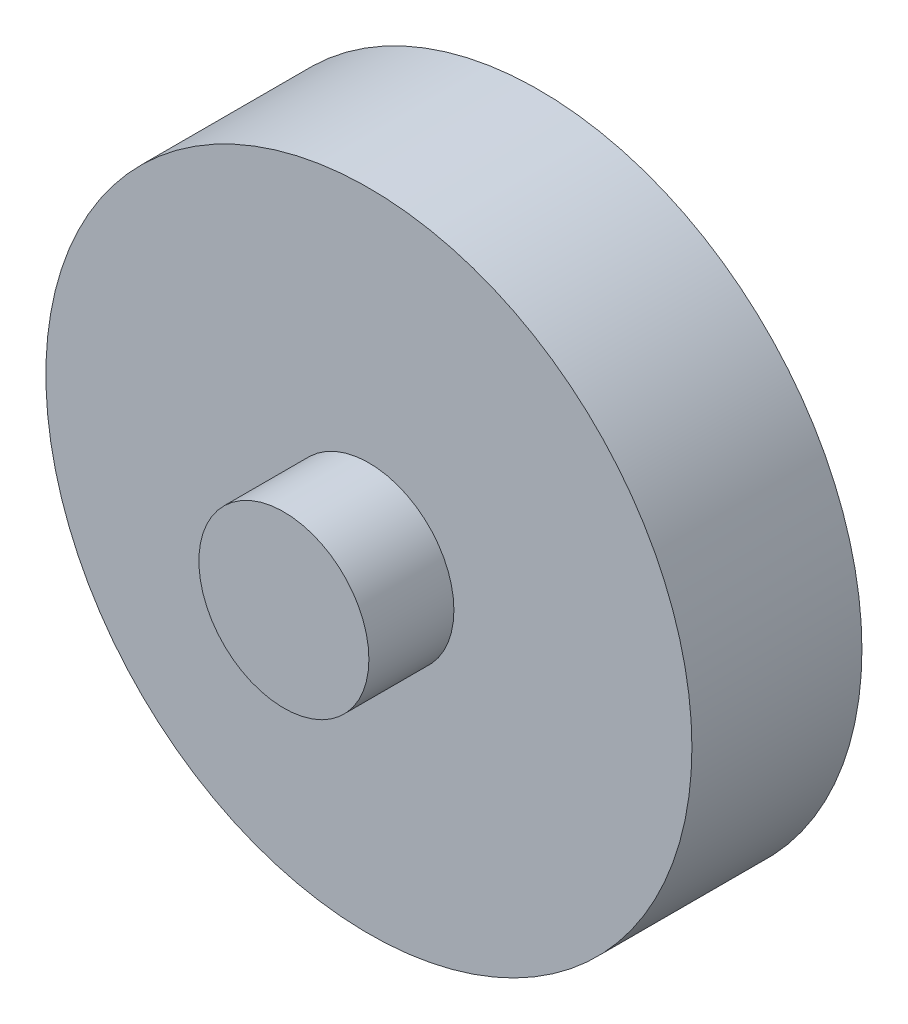
ISO-10303-21;
HEADER;
FILE_DESCRIPTION(('STEP AP214'),'2;1');
FILE_NAME('part.step','',(''),(''),'','','');
FILE_SCHEMA(('AUTOMOTIVE_DESIGN { 1 0 10303 214 1 1 1 1 }'));
ENDSEC;
DATA;
#1=APPLICATION_CONTEXT('core data for automotive mechanical design processes');
#2=APPLICATION_PROTOCOL_DEFINITION('international standard','automotive_design',2000,#1);
#3=PRODUCT_CONTEXT('',#1,'mechanical');
#4=PRODUCT('Part','Part','',(#3));
#5=PRODUCT_RELATED_PRODUCT_CATEGORY('part','',(#4));
#6=PRODUCT_DEFINITION_FORMATION('','',#4);
#7=PRODUCT_DEFINITION_CONTEXT('part definition',#1,'design');
#8=PRODUCT_DEFINITION('design','',#6,#7);
#9=PRODUCT_DEFINITION_SHAPE('','',#8);
#10=(LENGTH_UNIT() NAMED_UNIT(*) SI_UNIT(.MILLI.,.METRE.));
#11=(NAMED_UNIT(*) PLANE_ANGLE_UNIT() SI_UNIT($,.RADIAN.));
#12=(NAMED_UNIT(*) SI_UNIT($,.STERADIAN.) SOLID_ANGLE_UNIT());
#13=UNCERTAINTY_MEASURE_WITH_UNIT(LENGTH_MEASURE(1.E-05),#10,'distance_accuracy_value','');
#14=(GEOMETRIC_REPRESENTATION_CONTEXT(3) GLOBAL_UNCERTAINTY_ASSIGNED_CONTEXT((#13)) GLOBAL_UNIT_ASSIGNED_CONTEXT((#10,
#11,#12)) REPRESENTATION_CONTEXT('',''));
#15=CARTESIAN_POINT('',(0.,0.,0.));
#16=DIRECTION('',(0.,0.,1.));
#17=DIRECTION('',(1.,0.,0.));
#18=AXIS2_PLACEMENT_3D('',#15,#16,#17);
#19=CARTESIAN_POINT('',(0.,0.,25.4));
#20=DIRECTION('',(0.,0.,-1.));
#21=DIRECTION('',(-1.,0.,0.));
#22=AXIS2_PLACEMENT_3D('',#19,#20,#21);
#23=CYLINDRICAL_SURFACE('',#22,48.26);
#24=CARTESIAN_POINT('',(0.,0.,25.4));
#25=DIRECTION('',(0.,0.,1.));
#26=DIRECTION('',(1.,0.,0.));
#27=AXIS2_PLACEMENT_3D('',#24,#25,#26);
#28=CIRCLE('',#27,48.26);
#29=CARTESIAN_POINT('',(48.26,0.,25.4));
#30=VERTEX_POINT('',#29);
#31=EDGE_CURVE('E51',#30,#30,#28,.T.);
#32=ORIENTED_EDGE('',*,*,#31,.F.);
#33=EDGE_LOOP('',(#32));
#34=FACE_BOUND('',#33,.T.);
#35=CARTESIAN_POINT('',(0.,0.,0.));
#36=DIRECTION('',(0.,0.,1.));
#37=DIRECTION('',(1.,0.,0.));
#38=AXIS2_PLACEMENT_3D('',#35,#36,#37);
#39=CIRCLE('',#38,48.26);
#40=CARTESIAN_POINT('',(48.26,0.,0.));
#41=VERTEX_POINT('',#40);
#42=EDGE_CURVE('E40',#41,#41,#39,.T.);
#43=ORIENTED_EDGE('',*,*,#42,.T.);
#44=EDGE_LOOP('',(#43));
#45=FACE_BOUND('',#44,.T.);
#46=ADVANCED_FACE('F37',(#34,#45),#23,.T.);
#47=CARTESIAN_POINT('',(0.,0.,25.4));
#48=DIRECTION('',(0.,0.,1.));
#49=DIRECTION('',(1.,0.,0.));
#50=AXIS2_PLACEMENT_3D('',#47,#48,#49);
#51=PLANE('',#50);
#52=CARTESIAN_POINT('',(0.,0.,25.4));
#53=DIRECTION('',(0.,0.,1.));
#54=DIRECTION('',(1.,0.,0.));
#55=AXIS2_PLACEMENT_3D('',#52,#53,#54);
#56=CIRCLE('',#55,12.7);
#57=CARTESIAN_POINT('',(12.7,0.,25.4));
#58=VERTEX_POINT('',#57);
#59=EDGE_CURVE('E45',#58,#58,#56,.T.);
#60=ORIENTED_EDGE('',*,*,#59,.F.);
#61=EDGE_LOOP('',(#60));
#62=FACE_BOUND('',#61,.T.);
#63=ORIENTED_EDGE('',*,*,#31,.T.);
#64=EDGE_LOOP('',(#63));
#65=FACE_BOUND('',#64,.T.);
#66=ADVANCED_FACE('F71',(#62,#65),#51,.T.);
#67=CARTESIAN_POINT('',(0.,0.,0.));
#68=DIRECTION('',(0.,0.,1.));
#69=DIRECTION('',(1.,0.,0.));
#70=AXIS2_PLACEMENT_3D('',#67,#68,#69);
#71=PLANE('',#70);
#72=CARTESIAN_POINT('',(0.,0.,0.));
#73=DIRECTION('',(0.,0.,-1.));
#74=DIRECTION('',(-1.,0.,0.));
#75=AXIS2_PLACEMENT_3D('',#72,#73,#74);
#76=CIRCLE('',#75,12.7);
#77=CARTESIAN_POINT('',(-12.7,0.,0.));
#78=VERTEX_POINT('',#77);
#79=EDGE_CURVE('E10',#78,#78,#76,.T.);
#80=ORIENTED_EDGE('',*,*,#79,.F.);
#81=EDGE_LOOP('',(#80));
#82=FACE_BOUND('',#81,.T.);
#83=ORIENTED_EDGE('',*,*,#42,.F.);
#84=EDGE_LOOP('',(#83));
#85=FACE_BOUND('',#84,.T.);
#86=ADVANCED_FACE('F68',(#82,#85),#71,.F.);
#87=CARTESIAN_POINT('',(0.,0.,38.1));
#88=DIRECTION('',(0.,0.,-1.));
#89=DIRECTION('',(-1.,0.,0.));
#90=AXIS2_PLACEMENT_3D('',#87,#88,#89);
#91=CYLINDRICAL_SURFACE('',#90,12.7);
#92=CARTESIAN_POINT('',(0.,0.,38.1));
#93=DIRECTION('',(0.,0.,1.));
#94=DIRECTION('',(1.,0.,0.));
#95=AXIS2_PLACEMENT_3D('',#92,#93,#94);
#96=CIRCLE('',#95,12.7);
#97=CARTESIAN_POINT('',(12.7,0.,38.1));
#98=VERTEX_POINT('',#97);
#99=EDGE_CURVE('E56',#98,#98,#96,.T.);
#100=ORIENTED_EDGE('',*,*,#99,.F.);
#101=EDGE_LOOP('',(#100));
#102=FACE_BOUND('',#101,.T.);
#103=ORIENTED_EDGE('',*,*,#59,.T.);
#104=EDGE_LOOP('',(#103));
#105=FACE_BOUND('',#104,.T.);
#106=ADVANCED_FACE('F70',(#102,#105),#91,.T.);
#107=CARTESIAN_POINT('',(0.,0.,38.1));
#108=DIRECTION('',(0.,0.,1.));
#109=DIRECTION('',(1.,0.,0.));
#110=AXIS2_PLACEMENT_3D('',#107,#108,#109);
#111=PLANE('',#110);
#112=ORIENTED_EDGE('',*,*,#99,.T.);
#113=EDGE_LOOP('',(#112));
#114=FACE_BOUND('',#113,.T.);
#115=ADVANCED_FACE('F77',(#114),#111,.T.);
#116=CARTESIAN_POINT('',(0.,0.,-12.7));
#117=DIRECTION('',(0.,0.,1.));
#118=DIRECTION('',(1.,0.,0.));
#119=AXIS2_PLACEMENT_3D('',#116,#117,#118);
#120=CYLINDRICAL_SURFACE('',#119,12.7);
#121=CARTESIAN_POINT('',(0.,0.,-12.7));
#122=DIRECTION('',(0.,0.,-1.));
#123=DIRECTION('',(-1.,0.,0.));
#124=AXIS2_PLACEMENT_3D('',#121,#122,#123);
#125=CIRCLE('',#124,12.7);
#126=CARTESIAN_POINT('',(-12.7,0.,-12.7));
#127=VERTEX_POINT('',#126);
#128=EDGE_CURVE('E55',#127,#127,#125,.T.);
#129=ORIENTED_EDGE('',*,*,#128,.F.);
#130=EDGE_LOOP('',(#129));
#131=FACE_BOUND('',#130,.T.);
#132=ORIENTED_EDGE('',*,*,#79,.T.);
#133=EDGE_LOOP('',(#132));
#134=FACE_BOUND('',#133,.T.);
#135=ADVANCED_FACE('F105',(#131,#134),#120,.T.);
#136=CARTESIAN_POINT('',(0.,0.,-12.7));
#137=DIRECTION('',(0.,0.,-1.));
#138=DIRECTION('',(-1.,0.,0.));
#139=AXIS2_PLACEMENT_3D('',#136,#137,#138);
#140=PLANE('',#139);
#141=ORIENTED_EDGE('',*,*,#128,.T.);
#142=EDGE_LOOP('',(#141));
#143=FACE_BOUND('',#142,.T.);
#144=ADVANCED_FACE('F119',(#143),#140,.T.);
#145=CLOSED_SHELL('',(#46,#66,#86,#106,#115,#135,#144));
#146=MANIFOLD_SOLID_BREP('B2',#145);
#147=ADVANCED_BREP_SHAPE_REPRESENTATION('',(#18,#146),#14);
#148=SHAPE_DEFINITION_REPRESENTATION(#9,#147);
ENDSEC;
END-ISO-10303-21;
